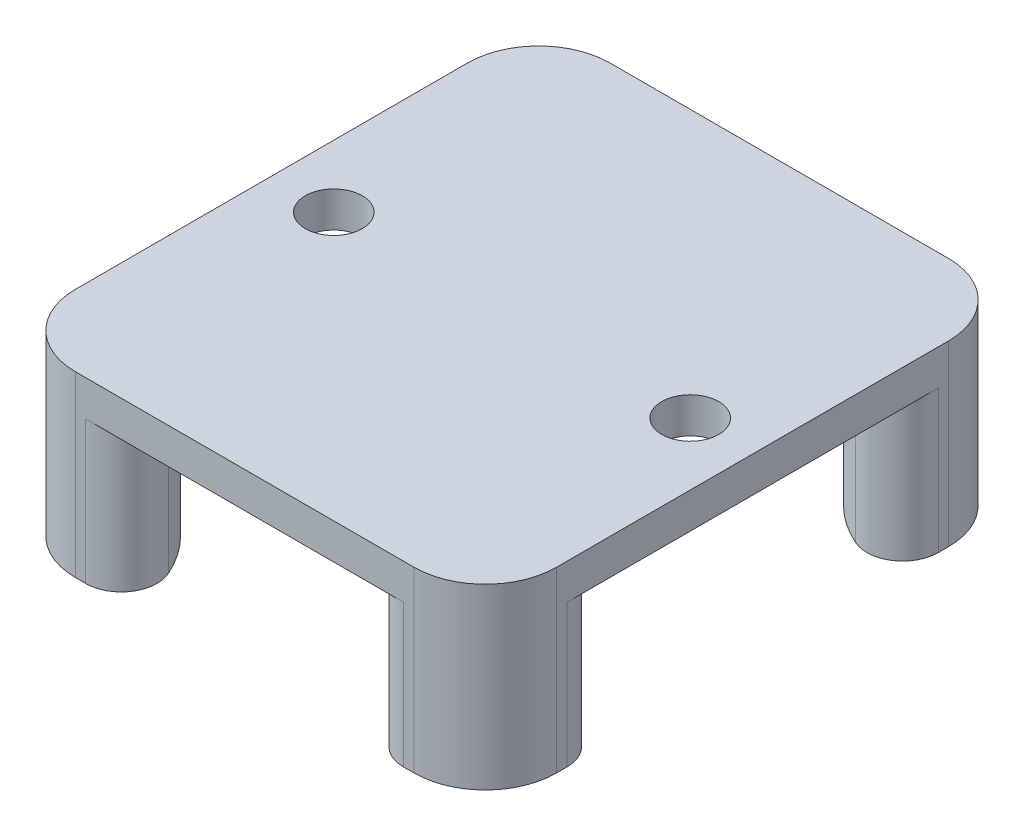
ISO-10303-21;
HEADER;
FILE_DESCRIPTION(('STEP AP214'),'2;1');
FILE_NAME('part.step','',(''),(''),'','','');
FILE_SCHEMA(('AUTOMOTIVE_DESIGN { 1 0 10303 214 1 1 1 1 }'));
ENDSEC;
DATA;
#1=APPLICATION_CONTEXT('core data for automotive mechanical design processes');
#2=APPLICATION_PROTOCOL_DEFINITION('international standard','automotive_design',2000,#1);
#3=PRODUCT_CONTEXT('',#1,'mechanical');
#4=PRODUCT('Part','Part','',(#3));
#5=PRODUCT_RELATED_PRODUCT_CATEGORY('part','',(#4));
#6=PRODUCT_DEFINITION_FORMATION('','',#4);
#7=PRODUCT_DEFINITION_CONTEXT('part definition',#1,'design');
#8=PRODUCT_DEFINITION('design','',#6,#7);
#9=PRODUCT_DEFINITION_SHAPE('','',#8);
#10=(LENGTH_UNIT() NAMED_UNIT(*) SI_UNIT(.MILLI.,.METRE.));
#11=(NAMED_UNIT(*) PLANE_ANGLE_UNIT() SI_UNIT($,.RADIAN.));
#12=(NAMED_UNIT(*) SI_UNIT($,.STERADIAN.) SOLID_ANGLE_UNIT());
#13=UNCERTAINTY_MEASURE_WITH_UNIT(LENGTH_MEASURE(1.E-05),#10,'distance_accuracy_value','');
#14=(GEOMETRIC_REPRESENTATION_CONTEXT(3) GLOBAL_UNCERTAINTY_ASSIGNED_CONTEXT((#13)) GLOBAL_UNIT_ASSIGNED_CONTEXT((#10,
#11,#12)) REPRESENTATION_CONTEXT('',''));
#15=CARTESIAN_POINT('',(0.,0.,0.));
#16=DIRECTION('',(0.,0.,1.));
#17=DIRECTION('',(1.,0.,0.));
#18=AXIS2_PLACEMENT_3D('',#15,#16,#17);
#19=CARTESIAN_POINT('',(0.,0.,0.));
#20=DIRECTION('',(0.,-1.,0.));
#21=DIRECTION('',(0.,0.,-1.));
#22=AXIS2_PLACEMENT_3D('',#19,#20,#21);
#23=PLANE('',#22);
#24=CARTESIAN_POINT('',(10.,0.,0.));
#25=DIRECTION('',(0.,1.,0.));
#26=DIRECTION('',(0.,0.,1.));
#27=AXIS2_PLACEMENT_3D('',#24,#25,#26);
#28=CIRCLE('',#27,1.6);
#29=CARTESIAN_POINT('',(10.,0.,1.6));
#30=VERTEX_POINT('',#29);
#31=EDGE_CURVE('E437',#30,#30,#28,.T.);
#32=ORIENTED_EDGE('',*,*,#31,.T.);
#33=EDGE_LOOP('',(#32));
#34=FACE_BOUND('',#33,.T.);
#35=CARTESIAN_POINT('',(-10.,0.,0.));
#36=DIRECTION('',(0.,1.,0.));
#37=DIRECTION('',(0.,0.,1.));
#38=AXIS2_PLACEMENT_3D('',#35,#36,#37);
#39=CIRCLE('',#38,1.6);
#40=CARTESIAN_POINT('',(-10.,0.,1.6));
#41=VERTEX_POINT('',#40);
#42=EDGE_CURVE('E429',#41,#41,#39,.T.);
#43=ORIENTED_EDGE('',*,*,#42,.T.);
#44=EDGE_LOOP('',(#43));
#45=FACE_BOUND('',#44,.T.);
#46=DIRECTION('',(0.,0.,1.));
#47=VECTOR('',#46,1.);
#48=CARTESIAN_POINT('',(-13.5,0.,15.));
#49=LINE('',#48,#47);
#50=CARTESIAN_POINT('',(-13.5,0.,-10.4174243050442));
#51=VERTEX_POINT('',#50);
#52=CARTESIAN_POINT('',(-13.5,0.,10.4174243050442));
#53=VERTEX_POINT('',#52);
#54=EDGE_CURVE('E468',#51,#53,#49,.T.);
#55=ORIENTED_EDGE('',*,*,#54,.F.);
#56=CARTESIAN_POINT('',(-11.5,0.,-10.4174243050442));
#57=DIRECTION('',(0.,-1.,0.));
#58=DIRECTION('',(0.,0.,-1.));
#59=AXIS2_PLACEMENT_3D('',#56,#57,#58);
#60=CIRCLE('',#59,2.);
#61=CARTESIAN_POINT('',(-10.7,0.,-8.58439402706182));
#62=VERTEX_POINT('',#61);
#63=EDGE_CURVE('E369',#51,#62,#60,.F.);
#64=ORIENTED_EDGE('',*,*,#63,.T.);
#65=CARTESIAN_POINT('',(-13.5,0.,-15.));
#66=DIRECTION('',(0.,-1.,0.));
#67=DIRECTION('',(0.,0.,-1.));
#68=AXIS2_PLACEMENT_3D('',#65,#66,#67);
#69=CIRCLE('',#68,7.);
#70=CARTESIAN_POINT('',(-7.08439402706182,0.,-12.2));
#71=VERTEX_POINT('',#70);
#72=EDGE_CURVE('E404',#71,#62,#69,.T.);
#73=ORIENTED_EDGE('',*,*,#72,.F.);
#74=CARTESIAN_POINT('',(-8.91742430504416,0.,-13.));
#75=DIRECTION('',(0.,-1.,0.));
#76=DIRECTION('',(0.,0.,-1.));
#77=AXIS2_PLACEMENT_3D('',#74,#75,#76);
#78=CIRCLE('',#77,2.);
#79=CARTESIAN_POINT('',(-8.91742430504416,0.,-15.));
#80=VERTEX_POINT('',#79);
#81=EDGE_CURVE('E372',#71,#80,#78,.F.);
#82=ORIENTED_EDGE('',*,*,#81,.T.);
#83=DIRECTION('',(-1.,0.,0.));
#84=VECTOR('',#83,1.);
#85=CARTESIAN_POINT('',(-13.5,0.,-15.));
#86=LINE('',#85,#84);
#87=CARTESIAN_POINT('',(8.91742430504416,0.,-15.));
#88=VERTEX_POINT('',#87);
#89=EDGE_CURVE('E465',#88,#80,#86,.T.);
#90=ORIENTED_EDGE('',*,*,#89,.F.);
#91=CARTESIAN_POINT('',(8.91742430504416,0.,-13.));
#92=DIRECTION('',(0.,-1.,0.));
#93=DIRECTION('',(0.,0.,-1.));
#94=AXIS2_PLACEMENT_3D('',#91,#92,#93);
#95=CIRCLE('',#94,2.);
#96=CARTESIAN_POINT('',(7.08439402706182,0.,-12.2));
#97=VERTEX_POINT('',#96);
#98=EDGE_CURVE('E11',#88,#97,#95,.F.);
#99=ORIENTED_EDGE('',*,*,#98,.T.);
#100=CARTESIAN_POINT('',(13.5,0.,-15.));
#101=DIRECTION('',(0.,-1.,0.));
#102=DIRECTION('',(0.,0.,1.));
#103=AXIS2_PLACEMENT_3D('',#100,#101,#102);
#104=CIRCLE('',#103,7.);
#105=CARTESIAN_POINT('',(10.7,0.,-8.58439402706182));
#106=VERTEX_POINT('',#105);
#107=EDGE_CURVE('E382',#106,#97,#104,.T.);
#108=ORIENTED_EDGE('',*,*,#107,.F.);
#109=CARTESIAN_POINT('',(11.5,0.,-10.4174243050442));
#110=DIRECTION('',(0.,-1.,0.));
#111=DIRECTION('',(0.,0.,-1.));
#112=AXIS2_PLACEMENT_3D('',#109,#110,#111);
#113=CIRCLE('',#112,2.);
#114=CARTESIAN_POINT('',(13.5,0.,-10.4174243050442));
#115=VERTEX_POINT('',#114);
#116=EDGE_CURVE('E48',#106,#115,#113,.F.);
#117=ORIENTED_EDGE('',*,*,#116,.T.);
#118=DIRECTION('',(0.,0.,-1.));
#119=VECTOR('',#118,1.);
#120=CARTESIAN_POINT('',(13.5,0.,15.));
#121=LINE('',#120,#119);
#122=CARTESIAN_POINT('',(13.5,0.,10.4174243050442));
#123=VERTEX_POINT('',#122);
#124=EDGE_CURVE('E380',#123,#115,#121,.T.);
#125=ORIENTED_EDGE('',*,*,#124,.F.);
#126=CARTESIAN_POINT('',(11.5,0.,10.4174243050442));
#127=DIRECTION('',(0.,-1.,0.));
#128=DIRECTION('',(0.,0.,-1.));
#129=AXIS2_PLACEMENT_3D('',#126,#127,#128);
#130=CIRCLE('',#129,2.);
#131=CARTESIAN_POINT('',(10.7,0.,8.58439402706182));
#132=VERTEX_POINT('',#131);
#133=EDGE_CURVE('E362',#123,#132,#130,.F.);
#134=ORIENTED_EDGE('',*,*,#133,.T.);
#135=CARTESIAN_POINT('',(13.5,0.,15.));
#136=DIRECTION('',(0.,-1.,0.));
#137=DIRECTION('',(0.,0.,-1.));
#138=AXIS2_PLACEMENT_3D('',#135,#136,#137);
#139=CIRCLE('',#138,7.);
#140=CARTESIAN_POINT('',(7.08439402706182,0.,12.2));
#141=VERTEX_POINT('',#140);
#142=EDGE_CURVE('E408',#141,#132,#139,.T.);
#143=ORIENTED_EDGE('',*,*,#142,.F.);
#144=CARTESIAN_POINT('',(8.91742430504416,0.,13.));
#145=DIRECTION('',(0.,-1.,0.));
#146=DIRECTION('',(0.,0.,-1.));
#147=AXIS2_PLACEMENT_3D('',#144,#145,#146);
#148=CIRCLE('',#147,2.);
#149=CARTESIAN_POINT('',(8.91742430504416,0.,15.));
#150=VERTEX_POINT('',#149);
#151=EDGE_CURVE('E365',#141,#150,#148,.F.);
#152=ORIENTED_EDGE('',*,*,#151,.T.);
#153=DIRECTION('',(1.,0.,0.));
#154=VECTOR('',#153,1.);
#155=CARTESIAN_POINT('',(-13.5,0.,15.));
#156=LINE('',#155,#154);
#157=CARTESIAN_POINT('',(-8.91742430504416,0.,15.));
#158=VERTEX_POINT('',#157);
#159=EDGE_CURVE('E453',#158,#150,#156,.T.);
#160=ORIENTED_EDGE('',*,*,#159,.F.);
#161=CARTESIAN_POINT('',(-8.91742430504416,0.,13.));
#162=DIRECTION('',(0.,-1.,0.));
#163=DIRECTION('',(0.,0.,-1.));
#164=AXIS2_PLACEMENT_3D('',#161,#162,#163);
#165=CIRCLE('',#164,2.);
#166=CARTESIAN_POINT('',(-7.08439402706182,0.,12.2));
#167=VERTEX_POINT('',#166);
#168=EDGE_CURVE('E359',#158,#167,#165,.F.);
#169=ORIENTED_EDGE('',*,*,#168,.T.);
#170=CARTESIAN_POINT('',(-13.5,0.,15.));
#171=DIRECTION('',(0.,-1.,0.));
#172=DIRECTION('',(0.,0.,1.));
#173=AXIS2_PLACEMENT_3D('',#170,#171,#172);
#174=CIRCLE('',#173,7.);
#175=CARTESIAN_POINT('',(-10.7,0.,8.58439402706182));
#176=VERTEX_POINT('',#175);
#177=EDGE_CURVE('E216',#176,#167,#174,.T.);
#178=ORIENTED_EDGE('',*,*,#177,.F.);
#179=CARTESIAN_POINT('',(-11.5,0.,10.4174243050442));
#180=DIRECTION('',(0.,-1.,0.));
#181=DIRECTION('',(0.,0.,-1.));
#182=AXIS2_PLACEMENT_3D('',#179,#180,#181);
#183=CIRCLE('',#182,2.);
#184=EDGE_CURVE('E355',#176,#53,#183,.F.);
#185=ORIENTED_EDGE('',*,*,#184,.T.);
#186=EDGE_LOOP('',(#55,#64,#73,#82,#90,#99,#108,#117,#125,#134,#143,#152,#160,#169,#178,#185));
#187=FACE_BOUND('',#186,.T.);
#188=ADVANCED_FACE('F39',(#34,#45,#187),#23,.T.);
#189=CARTESIAN_POINT('',(0.,2.,0.));
#190=DIRECTION('',(0.,-1.,0.));
#191=DIRECTION('',(0.,0.,-1.));
#192=AXIS2_PLACEMENT_3D('',#189,#190,#191);
#193=PLANE('',#192);
#194=DIRECTION('',(0.,0.,1.));
#195=VECTOR('',#194,1.);
#196=CARTESIAN_POINT('',(-13.5,2.,15.));
#197=LINE('',#196,#195);
#198=CARTESIAN_POINT('',(-13.5,2.,-11.));
#199=VERTEX_POINT('',#198);
#200=CARTESIAN_POINT('',(-13.5,2.,11.));
#201=VERTEX_POINT('',#200);
#202=EDGE_CURVE('E457',#199,#201,#197,.T.);
#203=ORIENTED_EDGE('',*,*,#202,.T.);
#204=CARTESIAN_POINT('',(-9.49999999999999,2.,11.));
#205=DIRECTION('',(0.,-1.,0.));
#206=DIRECTION('',(0.,0.,-1.));
#207=AXIS2_PLACEMENT_3D('',#204,#205,#206);
#208=CIRCLE('',#207,4.);
#209=CARTESIAN_POINT('',(-9.49999999999999,2.,15.));
#210=VERTEX_POINT('',#209);
#211=EDGE_CURVE('E253',#201,#210,#208,.F.);
#212=ORIENTED_EDGE('',*,*,#211,.T.);
#213=DIRECTION('',(1.,0.,0.));
#214=VECTOR('',#213,1.);
#215=CARTESIAN_POINT('',(-13.5,2.,15.));
#216=LINE('',#215,#214);
#217=CARTESIAN_POINT('',(9.50000000000001,2.,15.));
#218=VERTEX_POINT('',#217);
#219=EDGE_CURVE('E231',#210,#218,#216,.T.);
#220=ORIENTED_EDGE('',*,*,#219,.T.);
#221=CARTESIAN_POINT('',(9.50000000000001,2.,11.));
#222=DIRECTION('',(0.,-1.,0.));
#223=DIRECTION('',(0.,0.,-1.));
#224=AXIS2_PLACEMENT_3D('',#221,#222,#223);
#225=CIRCLE('',#224,4.);
#226=CARTESIAN_POINT('',(13.5,2.,11.));
#227=VERTEX_POINT('',#226);
#228=EDGE_CURVE('E250',#218,#227,#225,.F.);
#229=ORIENTED_EDGE('',*,*,#228,.T.);
#230=DIRECTION('',(0.,0.,-1.));
#231=VECTOR('',#230,1.);
#232=CARTESIAN_POINT('',(13.5,2.,15.));
#233=LINE('',#232,#231);
#234=CARTESIAN_POINT('',(13.5,2.,-11.));
#235=VERTEX_POINT('',#234);
#236=EDGE_CURVE('E448',#227,#235,#233,.T.);
#237=ORIENTED_EDGE('',*,*,#236,.T.);
#238=CARTESIAN_POINT('',(9.50000000000001,2.,-11.));
#239=DIRECTION('',(0.,-1.,0.));
#240=DIRECTION('',(0.,0.,-1.));
#241=AXIS2_PLACEMENT_3D('',#238,#239,#240);
#242=CIRCLE('',#241,4.);
#243=CARTESIAN_POINT('',(9.50000000000001,2.,-15.));
#244=VERTEX_POINT('',#243);
#245=EDGE_CURVE('E247',#235,#244,#242,.F.);
#246=ORIENTED_EDGE('',*,*,#245,.T.);
#247=DIRECTION('',(-1.,0.,0.));
#248=VECTOR('',#247,1.);
#249=CARTESIAN_POINT('',(-13.5,2.,-15.));
#250=LINE('',#249,#248);
#251=CARTESIAN_POINT('',(-9.49999999999999,2.,-15.));
#252=VERTEX_POINT('',#251);
#253=EDGE_CURVE('E452',#244,#252,#250,.T.);
#254=ORIENTED_EDGE('',*,*,#253,.T.);
#255=CARTESIAN_POINT('',(-9.49999999999999,2.,-11.));
#256=DIRECTION('',(0.,-1.,0.));
#257=DIRECTION('',(0.,0.,-1.));
#258=AXIS2_PLACEMENT_3D('',#255,#256,#257);
#259=CIRCLE('',#258,4.);
#260=EDGE_CURVE('E244',#252,#199,#259,.F.);
#261=ORIENTED_EDGE('',*,*,#260,.T.);
#262=EDGE_LOOP('',(#203,#212,#220,#229,#237,#246,#254,#261));
#263=FACE_BOUND('',#262,.T.);
#264=CARTESIAN_POINT('',(10.,2.,0.));
#265=DIRECTION('',(0.,1.,0.));
#266=DIRECTION('',(0.,0.,1.));
#267=AXIS2_PLACEMENT_3D('',#264,#265,#266);
#268=CIRCLE('',#267,1.6);
#269=CARTESIAN_POINT('',(10.,2.,1.6));
#270=VERTEX_POINT('',#269);
#271=EDGE_CURVE('E441',#270,#270,#268,.T.);
#272=ORIENTED_EDGE('',*,*,#271,.F.);
#273=EDGE_LOOP('',(#272));
#274=FACE_BOUND('',#273,.T.);
#275=CARTESIAN_POINT('',(-10.,2.,0.));
#276=DIRECTION('',(0.,1.,0.));
#277=DIRECTION('',(0.,0.,1.));
#278=AXIS2_PLACEMENT_3D('',#275,#276,#277);
#279=CIRCLE('',#278,1.6);
#280=CARTESIAN_POINT('',(-10.,2.,1.6));
#281=VERTEX_POINT('',#280);
#282=EDGE_CURVE('E433',#281,#281,#279,.T.);
#283=ORIENTED_EDGE('',*,*,#282,.F.);
#284=EDGE_LOOP('',(#283));
#285=FACE_BOUND('',#284,.T.);
#286=ADVANCED_FACE('F497',(#263,#274,#285),#193,.F.);
#287=CARTESIAN_POINT('',(13.5,2.,15.));
#288=DIRECTION('',(-1.,0.,0.));
#289=DIRECTION('',(0.,0.,1.));
#290=AXIS2_PLACEMENT_3D('',#287,#288,#289);
#291=PLANE('',#290);
#292=DIRECTION('',(0.,0.,1.));
#293=VECTOR('',#292,1.);
#294=CARTESIAN_POINT('',(13.5,-8.,8.));
#295=LINE('',#294,#293);
#296=CARTESIAN_POINT('',(13.5,-8.,10.4174243050442));
#297=VERTEX_POINT('',#296);
#298=CARTESIAN_POINT('',(13.5,-8.,11.));
#299=VERTEX_POINT('',#298);
#300=EDGE_CURVE('E414',#297,#299,#295,.T.);
#301=ORIENTED_EDGE('',*,*,#300,.F.);
#302=DIRECTION('',(0.,1.,0.));
#303=VECTOR('',#302,1.);
#304=CARTESIAN_POINT('',(13.5,2.,10.4174243050442));
#305=LINE('',#304,#303);
#306=EDGE_CURVE('E307',#297,#123,#305,.T.);
#307=ORIENTED_EDGE('',*,*,#306,.T.);
#308=ORIENTED_EDGE('',*,*,#124,.T.);
#309=DIRECTION('',(0.,1.,0.));
#310=VECTOR('',#309,1.);
#311=CARTESIAN_POINT('',(13.5,2.,-10.4174243050442));
#312=LINE('',#311,#310);
#313=CARTESIAN_POINT('',(13.5,-8.,-10.4174243050442));
#314=VERTEX_POINT('',#313);
#315=EDGE_CURVE('E304',#115,#314,#312,.F.);
#316=ORIENTED_EDGE('',*,*,#315,.T.);
#317=DIRECTION('',(0.,0.,1.));
#318=VECTOR('',#317,1.);
#319=CARTESIAN_POINT('',(13.5,-8.,-8.));
#320=LINE('',#319,#318);
#321=CARTESIAN_POINT('',(13.5,-8.,-11.));
#322=VERTEX_POINT('',#321);
#323=EDGE_CURVE('E390',#322,#314,#320,.T.);
#324=ORIENTED_EDGE('',*,*,#323,.F.);
#325=DIRECTION('',(0.,-1.,0.));
#326=VECTOR('',#325,1.);
#327=CARTESIAN_POINT('',(13.5,2.,-11.));
#328=LINE('',#327,#326);
#329=EDGE_CURVE('E256',#322,#235,#328,.F.);
#330=ORIENTED_EDGE('',*,*,#329,.T.);
#331=ORIENTED_EDGE('',*,*,#236,.F.);
#332=DIRECTION('',(0.,-1.,0.));
#333=VECTOR('',#332,1.);
#334=CARTESIAN_POINT('',(13.5,2.,11.));
#335=LINE('',#334,#333);
#336=EDGE_CURVE('E259',#227,#299,#335,.T.);
#337=ORIENTED_EDGE('',*,*,#336,.T.);
#338=EDGE_LOOP('',(#301,#307,#308,#316,#324,#330,#331,#337));
#339=FACE_BOUND('',#338,.T.);
#340=ADVANCED_FACE('F389',(#339),#291,.F.);
#341=CARTESIAN_POINT('',(-13.5,2.,-15.));
#342=DIRECTION('',(0.,0.,1.));
#343=DIRECTION('',(1.,0.,0.));
#344=AXIS2_PLACEMENT_3D('',#341,#342,#343);
#345=PLANE('',#344);
#346=ORIENTED_EDGE('',*,*,#89,.T.);
#347=DIRECTION('',(0.,1.,0.));
#348=VECTOR('',#347,1.);
#349=CARTESIAN_POINT('',(-8.91742430504416,2.,-15.));
#350=LINE('',#349,#348);
#351=CARTESIAN_POINT('',(-8.91742430504416,-8.,-15.));
#352=VERTEX_POINT('',#351);
#353=EDGE_CURVE('E341',#80,#352,#350,.F.);
#354=ORIENTED_EDGE('',*,*,#353,.T.);
#355=DIRECTION('',(1.,0.,0.));
#356=VECTOR('',#355,1.);
#357=CARTESIAN_POINT('',(-13.5,-8.,-15.));
#358=LINE('',#357,#356);
#359=CARTESIAN_POINT('',(-9.49999999999999,-8.,-15.));
#360=VERTEX_POINT('',#359);
#361=EDGE_CURVE('E401',#360,#352,#358,.T.);
#362=ORIENTED_EDGE('',*,*,#361,.F.);
#363=DIRECTION('',(0.,-1.,0.));
#364=VECTOR('',#363,1.);
#365=CARTESIAN_POINT('',(-9.49999999999999,2.,-15.));
#366=LINE('',#365,#364);
#367=EDGE_CURVE('E266',#360,#252,#366,.F.);
#368=ORIENTED_EDGE('',*,*,#367,.T.);
#369=ORIENTED_EDGE('',*,*,#253,.F.);
#370=DIRECTION('',(0.,-1.,0.));
#371=VECTOR('',#370,1.);
#372=CARTESIAN_POINT('',(9.50000000000001,2.,-15.));
#373=LINE('',#372,#371);
#374=CARTESIAN_POINT('',(9.50000000000001,-8.,-15.));
#375=VERTEX_POINT('',#374);
#376=EDGE_CURVE('E269',#244,#375,#373,.T.);
#377=ORIENTED_EDGE('',*,*,#376,.T.);
#378=DIRECTION('',(1.,0.,0.));
#379=VECTOR('',#378,1.);
#380=CARTESIAN_POINT('',(13.5,-8.,-15.));
#381=LINE('',#380,#379);
#382=CARTESIAN_POINT('',(8.91742430504416,-8.,-15.));
#383=VERTEX_POINT('',#382);
#384=EDGE_CURVE('E399',#383,#375,#381,.T.);
#385=ORIENTED_EDGE('',*,*,#384,.F.);
#386=DIRECTION('',(0.,1.,0.));
#387=VECTOR('',#386,1.);
#388=CARTESIAN_POINT('',(8.91742430504416,2.,-15.));
#389=LINE('',#388,#387);
#390=EDGE_CURVE('E337',#383,#88,#389,.T.);
#391=ORIENTED_EDGE('',*,*,#390,.T.);
#392=EDGE_LOOP('',(#346,#354,#362,#368,#369,#377,#385,#391));
#393=FACE_BOUND('',#392,.T.);
#394=ADVANCED_FACE('F517',(#393),#345,.F.);
#395=CARTESIAN_POINT('',(-13.5,2.,15.));
#396=DIRECTION('',(1.,0.,0.));
#397=DIRECTION('',(0.,0.,-1.));
#398=AXIS2_PLACEMENT_3D('',#395,#396,#397);
#399=PLANE('',#398);
#400=ORIENTED_EDGE('',*,*,#54,.T.);
#401=DIRECTION('',(0.,1.,0.));
#402=VECTOR('',#401,1.);
#403=CARTESIAN_POINT('',(-13.5,2.,10.4174243050442));
#404=LINE('',#403,#402);
#405=CARTESIAN_POINT('',(-13.5,-8.,10.4174243050442));
#406=VERTEX_POINT('',#405);
#407=EDGE_CURVE('E290',#53,#406,#404,.F.);
#408=ORIENTED_EDGE('',*,*,#407,.T.);
#409=DIRECTION('',(0.,0.,-1.));
#410=VECTOR('',#409,1.);
#411=CARTESIAN_POINT('',(-13.5,-8.,8.));
#412=LINE('',#411,#410);
#413=CARTESIAN_POINT('',(-13.5,-8.,11.));
#414=VERTEX_POINT('',#413);
#415=EDGE_CURVE('E215',#414,#406,#412,.T.);
#416=ORIENTED_EDGE('',*,*,#415,.F.);
#417=DIRECTION('',(0.,-1.,0.));
#418=VECTOR('',#417,1.);
#419=CARTESIAN_POINT('',(-13.5,2.,11.));
#420=LINE('',#419,#418);
#421=EDGE_CURVE('E224',#414,#201,#420,.F.);
#422=ORIENTED_EDGE('',*,*,#421,.T.);
#423=ORIENTED_EDGE('',*,*,#202,.F.);
#424=DIRECTION('',(0.,-1.,0.));
#425=VECTOR('',#424,1.);
#426=CARTESIAN_POINT('',(-13.5,2.,-11.));
#427=LINE('',#426,#425);
#428=CARTESIAN_POINT('',(-13.5,-8.,-11.));
#429=VERTEX_POINT('',#428);
#430=EDGE_CURVE('E226',#199,#429,#427,.T.);
#431=ORIENTED_EDGE('',*,*,#430,.T.);
#432=DIRECTION('',(0.,0.,-1.));
#433=VECTOR('',#432,1.);
#434=CARTESIAN_POINT('',(-13.5,-8.,-8.));
#435=LINE('',#434,#433);
#436=CARTESIAN_POINT('',(-13.5,-8.,-10.4174243050442));
#437=VERTEX_POINT('',#436);
#438=EDGE_CURVE('E515',#437,#429,#435,.T.);
#439=ORIENTED_EDGE('',*,*,#438,.F.);
#440=DIRECTION('',(0.,1.,0.));
#441=VECTOR('',#440,1.);
#442=CARTESIAN_POINT('',(-13.5,2.,-10.4174243050442));
#443=LINE('',#442,#441);
#444=EDGE_CURVE('E286',#437,#51,#443,.T.);
#445=ORIENTED_EDGE('',*,*,#444,.T.);
#446=EDGE_LOOP('',(#400,#408,#416,#422,#423,#431,#439,#445));
#447=FACE_BOUND('',#446,.T.);
#448=ADVANCED_FACE('F503',(#447),#399,.F.);
#449=CARTESIAN_POINT('',(-13.5,2.,15.));
#450=DIRECTION('',(0.,0.,-1.));
#451=DIRECTION('',(-1.,0.,0.));
#452=AXIS2_PLACEMENT_3D('',#449,#450,#451);
#453=PLANE('',#452);
#454=DIRECTION('',(-1.,0.,0.));
#455=VECTOR('',#454,1.);
#456=CARTESIAN_POINT('',(-13.5,-8.,15.));
#457=LINE('',#456,#455);
#458=CARTESIAN_POINT('',(-8.91742430504416,-8.,15.));
#459=VERTEX_POINT('',#458);
#460=CARTESIAN_POINT('',(-9.49999999999999,-8.,15.));
#461=VERTEX_POINT('',#460);
#462=EDGE_CURVE('E201',#459,#461,#457,.T.);
#463=ORIENTED_EDGE('',*,*,#462,.F.);
#464=DIRECTION('',(0.,1.,0.));
#465=VECTOR('',#464,1.);
#466=CARTESIAN_POINT('',(-8.91742430504416,2.,15.));
#467=LINE('',#466,#465);
#468=EDGE_CURVE('E301',#459,#158,#467,.T.);
#469=ORIENTED_EDGE('',*,*,#468,.T.);
#470=ORIENTED_EDGE('',*,*,#159,.T.);
#471=DIRECTION('',(0.,1.,0.));
#472=VECTOR('',#471,1.);
#473=CARTESIAN_POINT('',(8.91742430504416,2.,15.));
#474=LINE('',#473,#472);
#475=CARTESIAN_POINT('',(8.91742430504416,-8.,15.));
#476=VERTEX_POINT('',#475);
#477=EDGE_CURVE('E298',#150,#476,#474,.F.);
#478=ORIENTED_EDGE('',*,*,#477,.T.);
#479=DIRECTION('',(-1.,0.,0.));
#480=VECTOR('',#479,1.);
#481=CARTESIAN_POINT('',(13.5,-8.,15.));
#482=LINE('',#481,#480);
#483=CARTESIAN_POINT('',(9.50000000000001,-8.,15.));
#484=VERTEX_POINT('',#483);
#485=EDGE_CURVE('E417',#484,#476,#482,.T.);
#486=ORIENTED_EDGE('',*,*,#485,.F.);
#487=DIRECTION('',(0.,-1.,0.));
#488=VECTOR('',#487,1.);
#489=CARTESIAN_POINT('',(9.50000000000001,2.,15.));
#490=LINE('',#489,#488);
#491=EDGE_CURVE('E233',#484,#218,#490,.F.);
#492=ORIENTED_EDGE('',*,*,#491,.T.);
#493=ORIENTED_EDGE('',*,*,#219,.F.);
#494=DIRECTION('',(0.,-1.,0.));
#495=VECTOR('',#494,1.);
#496=CARTESIAN_POINT('',(-9.49999999999999,2.,15.));
#497=LINE('',#496,#495);
#498=EDGE_CURVE('E223',#210,#461,#497,.T.);
#499=ORIENTED_EDGE('',*,*,#498,.T.);
#500=EDGE_LOOP('',(#463,#469,#470,#478,#486,#492,#493,#499));
#501=FACE_BOUND('',#500,.T.);
#502=ADVANCED_FACE('F229',(#501),#453,.F.);
#503=CARTESIAN_POINT('',(10.,2.,0.));
#504=DIRECTION('',(0.,-1.,0.));
#505=DIRECTION('',(0.,0.,-1.));
#506=AXIS2_PLACEMENT_3D('',#503,#504,#505);
#507=CYLINDRICAL_SURFACE('',#506,1.6);
#508=ORIENTED_EDGE('',*,*,#271,.T.);
#509=EDGE_LOOP('',(#508));
#510=FACE_BOUND('',#509,.T.);
#511=ORIENTED_EDGE('',*,*,#31,.F.);
#512=EDGE_LOOP('',(#511));
#513=FACE_BOUND('',#512,.T.);
#514=ADVANCED_FACE('F571',(#510,#513),#507,.F.);
#515=CARTESIAN_POINT('',(-10.,2.,0.));
#516=DIRECTION('',(0.,-1.,0.));
#517=DIRECTION('',(0.,0.,-1.));
#518=AXIS2_PLACEMENT_3D('',#515,#516,#517);
#519=CYLINDRICAL_SURFACE('',#518,1.6);
#520=ORIENTED_EDGE('',*,*,#282,.T.);
#521=EDGE_LOOP('',(#520));
#522=FACE_BOUND('',#521,.T.);
#523=ORIENTED_EDGE('',*,*,#42,.F.);
#524=EDGE_LOOP('',(#523));
#525=FACE_BOUND('',#524,.T.);
#526=ADVANCED_FACE('F678',(#522,#525),#519,.F.);
#527=CARTESIAN_POINT('',(-13.5,-8.,15.));
#528=DIRECTION('',(0.,1.,0.));
#529=DIRECTION('',(0.,0.,1.));
#530=AXIS2_PLACEMENT_3D('',#527,#528,#529);
#531=CYLINDRICAL_SURFACE('',#530,7.);
#532=CARTESIAN_POINT('',(-13.5,-8.,15.));
#533=DIRECTION('',(0.,-1.,0.));
#534=DIRECTION('',(0.,0.,1.));
#535=AXIS2_PLACEMENT_3D('',#532,#533,#534);
#536=CIRCLE('',#535,7.);
#537=CARTESIAN_POINT('',(-10.7,-8.,8.58439402706182));
#538=VERTEX_POINT('',#537);
#539=CARTESIAN_POINT('',(-7.08439402706182,-8.,12.2));
#540=VERTEX_POINT('',#539);
#541=EDGE_CURVE('E426',#538,#540,#536,.T.);
#542=ORIENTED_EDGE('',*,*,#541,.F.);
#543=DIRECTION('',(0.,1.,0.));
#544=VECTOR('',#543,1.);
#545=CARTESIAN_POINT('',(-10.7,-8.,8.58439402706182));
#546=LINE('',#545,#544);
#547=EDGE_CURVE('E282',#538,#176,#546,.T.);
#548=ORIENTED_EDGE('',*,*,#547,.T.);
#549=ORIENTED_EDGE('',*,*,#177,.T.);
#550=DIRECTION('',(0.,1.,0.));
#551=VECTOR('',#550,1.);
#552=CARTESIAN_POINT('',(-7.08439402706182,-8.,12.2));
#553=LINE('',#552,#551);
#554=EDGE_CURVE('E279',#167,#540,#553,.F.);
#555=ORIENTED_EDGE('',*,*,#554,.T.);
#556=EDGE_LOOP('',(#542,#548,#549,#555));
#557=FACE_BOUND('',#556,.T.);
#558=ADVANCED_FACE('F547',(#557),#531,.T.);
#559=CARTESIAN_POINT('',(-13.5,-8.,15.));
#560=DIRECTION('',(0.,1.,0.));
#561=DIRECTION('',(0.,0.,1.));
#562=AXIS2_PLACEMENT_3D('',#559,#560,#561);
#563=PLANE('',#562);
#564=ORIENTED_EDGE('',*,*,#415,.T.);
#565=CARTESIAN_POINT('',(-11.5,-8.,10.4174243050442));
#566=DIRECTION('',(0.,1.,0.));
#567=DIRECTION('',(0.,0.,1.));
#568=AXIS2_PLACEMENT_3D('',#565,#566,#567);
#569=CIRCLE('',#568,2.);
#570=EDGE_CURVE('E295',#406,#538,#569,.F.);
#571=ORIENTED_EDGE('',*,*,#570,.T.);
#572=ORIENTED_EDGE('',*,*,#541,.T.);
#573=CARTESIAN_POINT('',(-8.91742430504416,-8.,13.));
#574=DIRECTION('',(0.,1.,0.));
#575=DIRECTION('',(0.,0.,1.));
#576=AXIS2_PLACEMENT_3D('',#573,#574,#575);
#577=CIRCLE('',#576,2.);
#578=EDGE_CURVE('E209',#540,#459,#577,.F.);
#579=ORIENTED_EDGE('',*,*,#578,.T.);
#580=ORIENTED_EDGE('',*,*,#462,.T.);
#581=CARTESIAN_POINT('',(-9.49999999999999,-8.,11.));
#582=DIRECTION('',(0.,1.,0.));
#583=DIRECTION('',(0.,0.,1.));
#584=AXIS2_PLACEMENT_3D('',#581,#582,#583);
#585=CIRCLE('',#584,4.);
#586=EDGE_CURVE('E205',#461,#414,#585,.F.);
#587=ORIENTED_EDGE('',*,*,#586,.T.);
#588=EDGE_LOOP('',(#564,#571,#572,#579,#580,#587));
#589=FACE_BOUND('',#588,.T.);
#590=ADVANCED_FACE('F204',(#589),#563,.F.);
#591=CARTESIAN_POINT('',(13.5,-8.,15.));
#592=DIRECTION('',(0.,1.,0.));
#593=DIRECTION('',(0.,0.,1.));
#594=AXIS2_PLACEMENT_3D('',#591,#592,#593);
#595=CYLINDRICAL_SURFACE('',#594,7.);
#596=ORIENTED_EDGE('',*,*,#142,.T.);
#597=DIRECTION('',(0.,1.,0.));
#598=VECTOR('',#597,1.);
#599=CARTESIAN_POINT('',(10.7,-8.,8.58439402706182));
#600=LINE('',#599,#598);
#601=CARTESIAN_POINT('',(10.7,-8.,8.58439402706182));
#602=VERTEX_POINT('',#601);
#603=EDGE_CURVE('E315',#132,#602,#600,.F.);
#604=ORIENTED_EDGE('',*,*,#603,.T.);
#605=CARTESIAN_POINT('',(13.5,-8.,15.));
#606=DIRECTION('',(0.,-1.,0.));
#607=DIRECTION('',(0.,0.,-1.));
#608=AXIS2_PLACEMENT_3D('',#605,#606,#607);
#609=CIRCLE('',#608,7.);
#610=CARTESIAN_POINT('',(7.08439402706182,-8.,12.2));
#611=VERTEX_POINT('',#610);
#612=EDGE_CURVE('E410',#611,#602,#609,.T.);
#613=ORIENTED_EDGE('',*,*,#612,.F.);
#614=DIRECTION('',(0.,1.,0.));
#615=VECTOR('',#614,1.);
#616=CARTESIAN_POINT('',(7.08439402706182,-8.,12.2));
#617=LINE('',#616,#615);
#618=EDGE_CURVE('E311',#611,#141,#617,.T.);
#619=ORIENTED_EDGE('',*,*,#618,.T.);
#620=EDGE_LOOP('',(#596,#604,#613,#619));
#621=FACE_BOUND('',#620,.T.);
#622=ADVANCED_FACE('F484',(#621),#595,.T.);
#623=CARTESIAN_POINT('',(13.5,-8.,15.));
#624=DIRECTION('',(0.,-1.,0.));
#625=DIRECTION('',(0.,0.,-1.));
#626=AXIS2_PLACEMENT_3D('',#623,#624,#625);
#627=PLANE('',#626);
#628=ORIENTED_EDGE('',*,*,#612,.T.);
#629=CARTESIAN_POINT('',(11.5,-8.,10.4174243050442));
#630=DIRECTION('',(0.,-1.,0.));
#631=DIRECTION('',(0.,0.,-1.));
#632=AXIS2_PLACEMENT_3D('',#629,#630,#631);
#633=CIRCLE('',#632,2.);
#634=EDGE_CURVE('E321',#602,#297,#633,.T.);
#635=ORIENTED_EDGE('',*,*,#634,.T.);
#636=ORIENTED_EDGE('',*,*,#300,.T.);
#637=CARTESIAN_POINT('',(9.50000000000001,-8.,11.));
#638=DIRECTION('',(0.,-1.,0.));
#639=DIRECTION('',(0.,0.,-1.));
#640=AXIS2_PLACEMENT_3D('',#637,#638,#639);
#641=CIRCLE('',#640,4.);
#642=EDGE_CURVE('E263',#299,#484,#641,.T.);
#643=ORIENTED_EDGE('',*,*,#642,.T.);
#644=ORIENTED_EDGE('',*,*,#485,.T.);
#645=CARTESIAN_POINT('',(8.91742430504416,-8.,13.));
#646=DIRECTION('',(0.,-1.,0.));
#647=DIRECTION('',(0.,0.,-1.));
#648=AXIS2_PLACEMENT_3D('',#645,#646,#647);
#649=CIRCLE('',#648,2.);
#650=EDGE_CURVE('E318',#476,#611,#649,.T.);
#651=ORIENTED_EDGE('',*,*,#650,.T.);
#652=EDGE_LOOP('',(#628,#635,#636,#643,#644,#651));
#653=FACE_BOUND('',#652,.T.);
#654=ADVANCED_FACE('F481',(#653),#627,.T.);
#655=CARTESIAN_POINT('',(13.5,-8.,-15.));
#656=DIRECTION('',(0.,1.,0.));
#657=DIRECTION('',(0.,0.,1.));
#658=AXIS2_PLACEMENT_3D('',#655,#656,#657);
#659=CYLINDRICAL_SURFACE('',#658,7.);
#660=CARTESIAN_POINT('',(13.5,-8.,-15.));
#661=DIRECTION('',(0.,-1.,0.));
#662=DIRECTION('',(0.,0.,1.));
#663=AXIS2_PLACEMENT_3D('',#660,#661,#662);
#664=CIRCLE('',#663,7.);
#665=CARTESIAN_POINT('',(10.7,-8.,-8.58439402706182));
#666=VERTEX_POINT('',#665);
#667=CARTESIAN_POINT('',(7.08439402706182,-8.,-12.2));
#668=VERTEX_POINT('',#667);
#669=EDGE_CURVE('E395',#666,#668,#664,.T.);
#670=ORIENTED_EDGE('',*,*,#669,.F.);
#671=DIRECTION('',(0.,1.,0.));
#672=VECTOR('',#671,1.);
#673=CARTESIAN_POINT('',(10.7,-8.,-8.58439402706182));
#674=LINE('',#673,#672);
#675=EDGE_CURVE('E346',#666,#106,#674,.T.);
#676=ORIENTED_EDGE('',*,*,#675,.T.);
#677=ORIENTED_EDGE('',*,*,#107,.T.);
#678=DIRECTION('',(0.,1.,0.));
#679=VECTOR('',#678,1.);
#680=CARTESIAN_POINT('',(7.08439402706182,-8.,-12.2));
#681=LINE('',#680,#679);
#682=EDGE_CURVE('E55',#97,#668,#681,.F.);
#683=ORIENTED_EDGE('',*,*,#682,.T.);
#684=EDGE_LOOP('',(#670,#676,#677,#683));
#685=FACE_BOUND('',#684,.T.);
#686=ADVANCED_FACE('F661',(#685),#659,.T.);
#687=CARTESIAN_POINT('',(13.5,-8.,-15.));
#688=DIRECTION('',(0.,1.,0.));
#689=DIRECTION('',(0.,0.,1.));
#690=AXIS2_PLACEMENT_3D('',#687,#688,#689);
#691=PLANE('',#690);
#692=ORIENTED_EDGE('',*,*,#323,.T.);
#693=CARTESIAN_POINT('',(11.5,-8.,-10.4174243050442));
#694=DIRECTION('',(0.,1.,0.));
#695=DIRECTION('',(0.,0.,1.));
#696=AXIS2_PLACEMENT_3D('',#693,#694,#695);
#697=CIRCLE('',#696,2.);
#698=EDGE_CURVE('E62',#314,#666,#697,.F.);
#699=ORIENTED_EDGE('',*,*,#698,.T.);
#700=ORIENTED_EDGE('',*,*,#669,.T.);
#701=CARTESIAN_POINT('',(8.91742430504416,-8.,-13.));
#702=DIRECTION('',(0.,1.,0.));
#703=DIRECTION('',(0.,0.,1.));
#704=AXIS2_PLACEMENT_3D('',#701,#702,#703);
#705=CIRCLE('',#704,2.);
#706=EDGE_CURVE('E350',#668,#383,#705,.F.);
#707=ORIENTED_EDGE('',*,*,#706,.T.);
#708=ORIENTED_EDGE('',*,*,#384,.T.);
#709=CARTESIAN_POINT('',(9.50000000000001,-8.,-11.));
#710=DIRECTION('',(0.,1.,0.));
#711=DIRECTION('',(0.,0.,1.));
#712=AXIS2_PLACEMENT_3D('',#709,#710,#711);
#713=CIRCLE('',#712,4.);
#714=EDGE_CURVE('E273',#375,#322,#713,.F.);
#715=ORIENTED_EDGE('',*,*,#714,.T.);
#716=EDGE_LOOP('',(#692,#699,#700,#707,#708,#715));
#717=FACE_BOUND('',#716,.T.);
#718=ADVANCED_FACE('F392',(#717),#691,.F.);
#719=CARTESIAN_POINT('',(-13.5,-8.,-15.));
#720=DIRECTION('',(0.,1.,0.));
#721=DIRECTION('',(0.,0.,1.));
#722=AXIS2_PLACEMENT_3D('',#719,#720,#721);
#723=CYLINDRICAL_SURFACE('',#722,7.);
#724=ORIENTED_EDGE('',*,*,#72,.T.);
#725=DIRECTION('',(0.,1.,0.));
#726=VECTOR('',#725,1.);
#727=CARTESIAN_POINT('',(-10.7,-8.,-8.58439402706182));
#728=LINE('',#727,#726);
#729=CARTESIAN_POINT('',(-10.7,-8.,-8.58439402706182));
#730=VERTEX_POINT('',#729);
#731=EDGE_CURVE('E328',#62,#730,#728,.F.);
#732=ORIENTED_EDGE('',*,*,#731,.T.);
#733=CARTESIAN_POINT('',(-13.5,-8.,-15.));
#734=DIRECTION('',(0.,-1.,0.));
#735=DIRECTION('',(0.,0.,-1.));
#736=AXIS2_PLACEMENT_3D('',#733,#734,#735);
#737=CIRCLE('',#736,7.);
#738=CARTESIAN_POINT('',(-7.08439402706182,-8.,-12.2));
#739=VERTEX_POINT('',#738);
#740=EDGE_CURVE('E522',#739,#730,#737,.T.);
#741=ORIENTED_EDGE('',*,*,#740,.F.);
#742=DIRECTION('',(0.,1.,0.));
#743=VECTOR('',#742,1.);
#744=CARTESIAN_POINT('',(-7.08439402706182,-8.,-12.2));
#745=LINE('',#744,#743);
#746=EDGE_CURVE('E324',#739,#71,#745,.T.);
#747=ORIENTED_EDGE('',*,*,#746,.T.);
#748=EDGE_LOOP('',(#724,#732,#741,#747));
#749=FACE_BOUND('',#748,.T.);
#750=ADVANCED_FACE('F533',(#749),#723,.T.);
#751=CARTESIAN_POINT('',(-13.5,-8.,-15.));
#752=DIRECTION('',(0.,-1.,0.));
#753=DIRECTION('',(0.,0.,-1.));
#754=AXIS2_PLACEMENT_3D('',#751,#752,#753);
#755=PLANE('',#754);
#756=ORIENTED_EDGE('',*,*,#740,.T.);
#757=CARTESIAN_POINT('',(-11.5,-8.,-10.4174243050442));
#758=DIRECTION('',(0.,-1.,0.));
#759=DIRECTION('',(0.,0.,-1.));
#760=AXIS2_PLACEMENT_3D('',#757,#758,#759);
#761=CIRCLE('',#760,2.);
#762=EDGE_CURVE('E334',#730,#437,#761,.T.);
#763=ORIENTED_EDGE('',*,*,#762,.T.);
#764=ORIENTED_EDGE('',*,*,#438,.T.);
#765=CARTESIAN_POINT('',(-9.49999999999999,-8.,-11.));
#766=DIRECTION('',(0.,-1.,0.));
#767=DIRECTION('',(0.,0.,-1.));
#768=AXIS2_PLACEMENT_3D('',#765,#766,#767);
#769=CIRCLE('',#768,4.);
#770=EDGE_CURVE('E276',#429,#360,#769,.T.);
#771=ORIENTED_EDGE('',*,*,#770,.T.);
#772=ORIENTED_EDGE('',*,*,#361,.T.);
#773=CARTESIAN_POINT('',(-8.91742430504416,-8.,-13.));
#774=DIRECTION('',(0.,-1.,0.));
#775=DIRECTION('',(0.,0.,-1.));
#776=AXIS2_PLACEMENT_3D('',#773,#774,#775);
#777=CIRCLE('',#776,2.);
#778=EDGE_CURVE('E331',#352,#739,#777,.T.);
#779=ORIENTED_EDGE('',*,*,#778,.T.);
#780=EDGE_LOOP('',(#756,#763,#764,#771,#772,#779));
#781=FACE_BOUND('',#780,.T.);
#782=ADVANCED_FACE('F513',(#781),#755,.T.);
#783=CARTESIAN_POINT('',(-9.49999999999999,2.,11.));
#784=DIRECTION('',(0.,-1.,0.));
#785=DIRECTION('',(0.,0.,-1.));
#786=AXIS2_PLACEMENT_3D('',#783,#784,#785);
#787=CYLINDRICAL_SURFACE('',#786,4.);
#788=ORIENTED_EDGE('',*,*,#211,.F.);
#789=ORIENTED_EDGE('',*,*,#421,.F.);
#790=ORIENTED_EDGE('',*,*,#586,.F.);
#791=ORIENTED_EDGE('',*,*,#498,.F.);
#792=EDGE_LOOP('',(#788,#789,#790,#791));
#793=FACE_BOUND('',#792,.T.);
#794=ADVANCED_FACE('F222',(#793),#787,.T.);
#795=CARTESIAN_POINT('',(9.50000000000001,2.,11.));
#796=DIRECTION('',(0.,-1.,0.));
#797=DIRECTION('',(0.,0.,-1.));
#798=AXIS2_PLACEMENT_3D('',#795,#796,#797);
#799=CYLINDRICAL_SURFACE('',#798,4.);
#800=ORIENTED_EDGE('',*,*,#228,.F.);
#801=ORIENTED_EDGE('',*,*,#491,.F.);
#802=ORIENTED_EDGE('',*,*,#642,.F.);
#803=ORIENTED_EDGE('',*,*,#336,.F.);
#804=EDGE_LOOP('',(#800,#801,#802,#803));
#805=FACE_BOUND('',#804,.T.);
#806=ADVANCED_FACE('F494',(#805),#799,.T.);
#807=CARTESIAN_POINT('',(9.50000000000001,2.,-11.));
#808=DIRECTION('',(0.,-1.,0.));
#809=DIRECTION('',(0.,0.,-1.));
#810=AXIS2_PLACEMENT_3D('',#807,#808,#809);
#811=CYLINDRICAL_SURFACE('',#810,4.);
#812=ORIENTED_EDGE('',*,*,#245,.F.);
#813=ORIENTED_EDGE('',*,*,#329,.F.);
#814=ORIENTED_EDGE('',*,*,#714,.F.);
#815=ORIENTED_EDGE('',*,*,#376,.F.);
#816=EDGE_LOOP('',(#812,#813,#814,#815));
#817=FACE_BOUND('',#816,.T.);
#818=ADVANCED_FACE('F582',(#817),#811,.T.);
#819=CARTESIAN_POINT('',(-9.49999999999999,2.,-11.));
#820=DIRECTION('',(0.,-1.,0.));
#821=DIRECTION('',(0.,0.,-1.));
#822=AXIS2_PLACEMENT_3D('',#819,#820,#821);
#823=CYLINDRICAL_SURFACE('',#822,4.);
#824=ORIENTED_EDGE('',*,*,#260,.F.);
#825=ORIENTED_EDGE('',*,*,#367,.F.);
#826=ORIENTED_EDGE('',*,*,#770,.F.);
#827=ORIENTED_EDGE('',*,*,#430,.F.);
#828=EDGE_LOOP('',(#824,#825,#826,#827));
#829=FACE_BOUND('',#828,.T.);
#830=ADVANCED_FACE('F507',(#829),#823,.T.);
#831=CARTESIAN_POINT('',(-11.5,-8.,10.4174243050442));
#832=DIRECTION('',(0.,1.,0.));
#833=DIRECTION('',(0.,0.,1.));
#834=AXIS2_PLACEMENT_3D('',#831,#832,#833);
#835=CYLINDRICAL_SURFACE('',#834,2.);
#836=ORIENTED_EDGE('',*,*,#570,.F.);
#837=ORIENTED_EDGE('',*,*,#407,.F.);
#838=ORIENTED_EDGE('',*,*,#184,.F.);
#839=ORIENTED_EDGE('',*,*,#547,.F.);
#840=EDGE_LOOP('',(#836,#837,#838,#839));
#841=FACE_BOUND('',#840,.T.);
#842=ADVANCED_FACE('F544',(#841),#835,.T.);
#843=CARTESIAN_POINT('',(-8.91742430504416,-8.,13.));
#844=DIRECTION('',(0.,1.,0.));
#845=DIRECTION('',(0.,0.,1.));
#846=AXIS2_PLACEMENT_3D('',#843,#844,#845);
#847=CYLINDRICAL_SURFACE('',#846,2.);
#848=ORIENTED_EDGE('',*,*,#578,.F.);
#849=ORIENTED_EDGE('',*,*,#554,.F.);
#850=ORIENTED_EDGE('',*,*,#168,.F.);
#851=ORIENTED_EDGE('',*,*,#468,.F.);
#852=EDGE_LOOP('',(#848,#849,#850,#851));
#853=FACE_BOUND('',#852,.T.);
#854=ADVANCED_FACE('F550',(#853),#847,.T.);
#855=CARTESIAN_POINT('',(11.5,-8.,10.4174243050442));
#856=DIRECTION('',(0.,1.,0.));
#857=DIRECTION('',(0.,0.,1.));
#858=AXIS2_PLACEMENT_3D('',#855,#856,#857);
#859=CYLINDRICAL_SURFACE('',#858,2.);
#860=ORIENTED_EDGE('',*,*,#634,.F.);
#861=ORIENTED_EDGE('',*,*,#603,.F.);
#862=ORIENTED_EDGE('',*,*,#133,.F.);
#863=ORIENTED_EDGE('',*,*,#306,.F.);
#864=EDGE_LOOP('',(#860,#861,#862,#863));
#865=FACE_BOUND('',#864,.T.);
#866=ADVANCED_FACE('F487',(#865),#859,.T.);
#867=CARTESIAN_POINT('',(8.91742430504416,-8.,13.));
#868=DIRECTION('',(0.,1.,0.));
#869=DIRECTION('',(0.,0.,1.));
#870=AXIS2_PLACEMENT_3D('',#867,#868,#869);
#871=CYLINDRICAL_SURFACE('',#870,2.);
#872=ORIENTED_EDGE('',*,*,#650,.F.);
#873=ORIENTED_EDGE('',*,*,#477,.F.);
#874=ORIENTED_EDGE('',*,*,#151,.F.);
#875=ORIENTED_EDGE('',*,*,#618,.F.);
#876=EDGE_LOOP('',(#872,#873,#874,#875));
#877=FACE_BOUND('',#876,.T.);
#878=ADVANCED_FACE('F478',(#877),#871,.T.);
#879=CARTESIAN_POINT('',(-11.5,-8.,-10.4174243050442));
#880=DIRECTION('',(0.,1.,0.));
#881=DIRECTION('',(0.,0.,1.));
#882=AXIS2_PLACEMENT_3D('',#879,#880,#881);
#883=CYLINDRICAL_SURFACE('',#882,2.);
#884=ORIENTED_EDGE('',*,*,#762,.F.);
#885=ORIENTED_EDGE('',*,*,#731,.F.);
#886=ORIENTED_EDGE('',*,*,#63,.F.);
#887=ORIENTED_EDGE('',*,*,#444,.F.);
#888=EDGE_LOOP('',(#884,#885,#886,#887));
#889=FACE_BOUND('',#888,.T.);
#890=ADVANCED_FACE('F537',(#889),#883,.T.);
#891=CARTESIAN_POINT('',(-8.91742430504416,-8.,-13.));
#892=DIRECTION('',(0.,1.,0.));
#893=DIRECTION('',(0.,0.,1.));
#894=AXIS2_PLACEMENT_3D('',#891,#892,#893);
#895=CYLINDRICAL_SURFACE('',#894,2.);
#896=ORIENTED_EDGE('',*,*,#778,.F.);
#897=ORIENTED_EDGE('',*,*,#353,.F.);
#898=ORIENTED_EDGE('',*,*,#81,.F.);
#899=ORIENTED_EDGE('',*,*,#746,.F.);
#900=EDGE_LOOP('',(#896,#897,#898,#899));
#901=FACE_BOUND('',#900,.T.);
#902=ADVANCED_FACE('F627',(#901),#895,.T.);
#903=CARTESIAN_POINT('',(11.5,-8.,-10.4174243050442));
#904=DIRECTION('',(0.,1.,0.));
#905=DIRECTION('',(0.,0.,1.));
#906=AXIS2_PLACEMENT_3D('',#903,#904,#905);
#907=CYLINDRICAL_SURFACE('',#906,2.);
#908=ORIENTED_EDGE('',*,*,#698,.F.);
#909=ORIENTED_EDGE('',*,*,#315,.F.);
#910=ORIENTED_EDGE('',*,*,#116,.F.);
#911=ORIENTED_EDGE('',*,*,#675,.F.);
#912=EDGE_LOOP('',(#908,#909,#910,#911));
#913=FACE_BOUND('',#912,.T.);
#914=ADVANCED_FACE('F385',(#913),#907,.T.);
#915=CARTESIAN_POINT('',(8.91742430504416,-8.,-13.));
#916=DIRECTION('',(0.,1.,0.));
#917=DIRECTION('',(0.,0.,1.));
#918=AXIS2_PLACEMENT_3D('',#915,#916,#917);
#919=CYLINDRICAL_SURFACE('',#918,2.);
#920=ORIENTED_EDGE('',*,*,#706,.F.);
#921=ORIENTED_EDGE('',*,*,#682,.F.);
#922=ORIENTED_EDGE('',*,*,#98,.F.);
#923=ORIENTED_EDGE('',*,*,#390,.F.);
#924=EDGE_LOOP('',(#920,#921,#922,#923));
#925=FACE_BOUND('',#924,.T.);
#926=ADVANCED_FACE('F41',(#925),#919,.T.);
#927=CLOSED_SHELL('',(#188,#286,#340,#394,#448,#502,#514,#526,#558,#590,#622,#654,#686,#718,
#750,#782,#794,#806,#818,#830,#842,#854,#866,#878,#890,#902,#914,#926));
#928=MANIFOLD_SOLID_BREP('B2',#927);
#929=ADVANCED_BREP_SHAPE_REPRESENTATION('',(#18,#928),#14);
#930=SHAPE_DEFINITION_REPRESENTATION(#9,#929);
ENDSEC;
END-ISO-10303-21;
